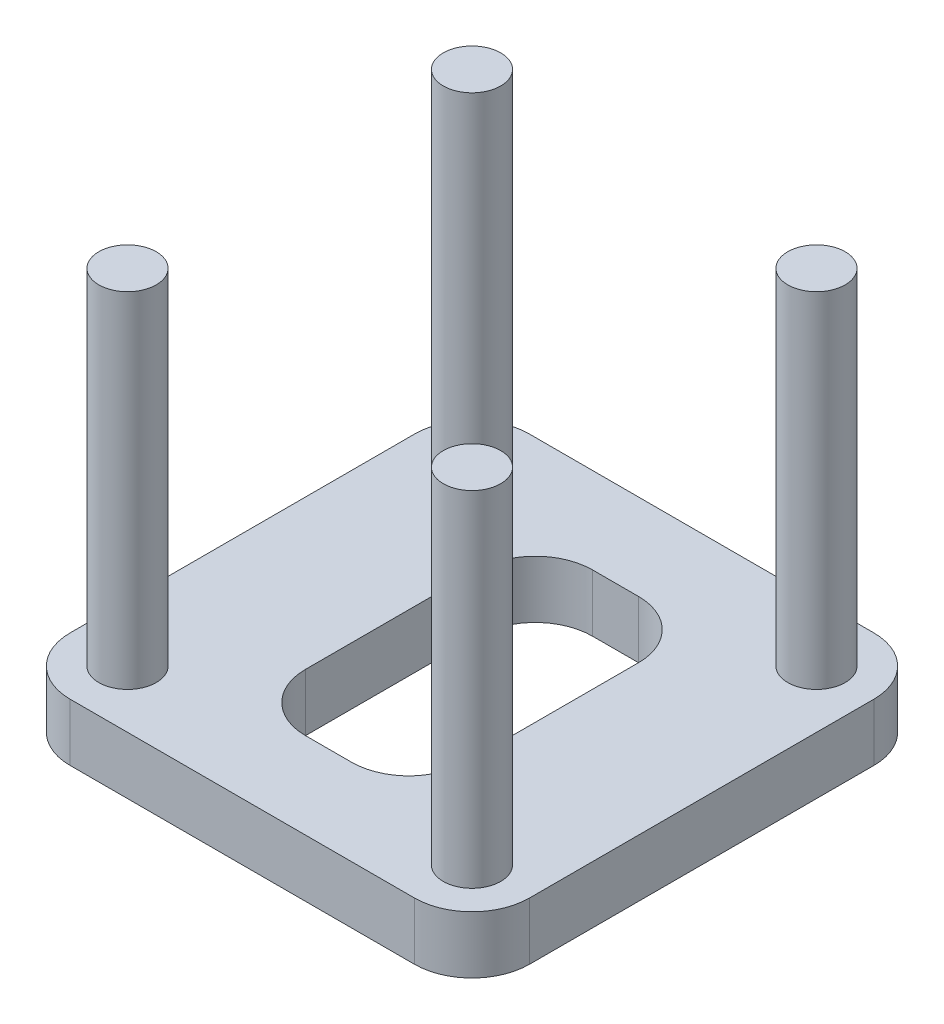
ISO-10303-21;
HEADER;
FILE_DESCRIPTION(('STEP AP214'),'2;1');
FILE_NAME('part.step','',(''),(''),'','','');
FILE_SCHEMA(('AUTOMOTIVE_DESIGN { 1 0 10303 214 1 1 1 1 }'));
ENDSEC;
DATA;
#1=APPLICATION_CONTEXT('core data for automotive mechanical design processes');
#2=APPLICATION_PROTOCOL_DEFINITION('international standard','automotive_design',2000,#1);
#3=PRODUCT_CONTEXT('',#1,'mechanical');
#4=PRODUCT('Part','Part','',(#3));
#5=PRODUCT_RELATED_PRODUCT_CATEGORY('part','',(#4));
#6=PRODUCT_DEFINITION_FORMATION('','',#4);
#7=PRODUCT_DEFINITION_CONTEXT('part definition',#1,'design');
#8=PRODUCT_DEFINITION('design','',#6,#7);
#9=PRODUCT_DEFINITION_SHAPE('','',#8);
#10=(LENGTH_UNIT() NAMED_UNIT(*) SI_UNIT(.MILLI.,.METRE.));
#11=(NAMED_UNIT(*) PLANE_ANGLE_UNIT() SI_UNIT($,.RADIAN.));
#12=(NAMED_UNIT(*) SI_UNIT($,.STERADIAN.) SOLID_ANGLE_UNIT());
#13=UNCERTAINTY_MEASURE_WITH_UNIT(LENGTH_MEASURE(1.E-05),#10,'distance_accuracy_value','');
#14=(GEOMETRIC_REPRESENTATION_CONTEXT(3) GLOBAL_UNCERTAINTY_ASSIGNED_CONTEXT((#13)) GLOBAL_UNIT_ASSIGNED_CONTEXT((#10,
#11,#12)) REPRESENTATION_CONTEXT('',''));
#15=CARTESIAN_POINT('',(0.,0.,0.));
#16=DIRECTION('',(0.,0.,1.));
#17=DIRECTION('',(1.,0.,0.));
#18=AXIS2_PLACEMENT_3D('',#15,#16,#17);
#19=CARTESIAN_POINT('',(0.,0.,0.));
#20=DIRECTION('',(0.,-1.,0.));
#21=DIRECTION('',(0.,0.,-1.));
#22=AXIS2_PLACEMENT_3D('',#19,#20,#21);
#23=PLANE('',#22);
#24=CARTESIAN_POINT('',(4.00000000000001,0.,15.));
#25=DIRECTION('',(0.,1.,0.));
#26=DIRECTION('',(0.,0.,1.));
#27=AXIS2_PLACEMENT_3D('',#24,#25,#26);
#28=CIRCLE('',#27,10.);
#29=CARTESIAN_POINT('',(4.00000000000001,0.,25.));
#30=VERTEX_POINT('',#29);
#31=CARTESIAN_POINT('',(14.,0.,15.));
#32=VERTEX_POINT('',#31);
#33=EDGE_CURVE('E202',#30,#32,#28,.T.);
#34=ORIENTED_EDGE('',*,*,#33,.T.);
#35=DIRECTION('',(0.,0.,-1.));
#36=VECTOR('',#35,1.);
#37=CARTESIAN_POINT('',(14.,0.,15.));
#38=LINE('',#37,#36);
#39=CARTESIAN_POINT('',(14.,0.,-15.));
#40=VERTEX_POINT('',#39);
#41=EDGE_CURVE('E211',#32,#40,#38,.T.);
#42=ORIENTED_EDGE('',*,*,#41,.T.);
#43=CARTESIAN_POINT('',(4.00000000000001,0.,-15.));
#44=DIRECTION('',(0.,1.,0.));
#45=DIRECTION('',(0.,0.,-1.));
#46=AXIS2_PLACEMENT_3D('',#43,#44,#45);
#47=CIRCLE('',#46,10.);
#48=CARTESIAN_POINT('',(4.00000000000001,0.,-25.));
#49=VERTEX_POINT('',#48);
#50=EDGE_CURVE('E54',#40,#49,#47,.T.);
#51=ORIENTED_EDGE('',*,*,#50,.T.);
#52=DIRECTION('',(-1.,0.,0.));
#53=VECTOR('',#52,1.);
#54=CARTESIAN_POINT('',(-4.00000000000001,0.,-25.));
#55=LINE('',#54,#53);
#56=CARTESIAN_POINT('',(-4.00000000000001,0.,-25.));
#57=VERTEX_POINT('',#56);
#58=EDGE_CURVE('E228',#49,#57,#55,.T.);
#59=ORIENTED_EDGE('',*,*,#58,.T.);
#60=CARTESIAN_POINT('',(-4.00000000000001,0.,-15.));
#61=DIRECTION('',(0.,1.,0.));
#62=DIRECTION('',(0.,0.,-1.));
#63=AXIS2_PLACEMENT_3D('',#60,#61,#62);
#64=CIRCLE('',#63,10.);
#65=CARTESIAN_POINT('',(-14.,0.,-15.));
#66=VERTEX_POINT('',#65);
#67=EDGE_CURVE('E231',#57,#66,#64,.T.);
#68=ORIENTED_EDGE('',*,*,#67,.T.);
#69=DIRECTION('',(0.,0.,1.));
#70=VECTOR('',#69,1.);
#71=CARTESIAN_POINT('',(-14.,0.,15.));
#72=LINE('',#71,#70);
#73=CARTESIAN_POINT('',(-14.,0.,15.));
#74=VERTEX_POINT('',#73);
#75=EDGE_CURVE('E234',#66,#74,#72,.T.);
#76=ORIENTED_EDGE('',*,*,#75,.T.);
#77=CARTESIAN_POINT('',(-4.00000000000001,0.,15.));
#78=DIRECTION('',(0.,1.,0.));
#79=DIRECTION('',(0.,0.,-1.));
#80=AXIS2_PLACEMENT_3D('',#77,#78,#79);
#81=CIRCLE('',#80,10.);
#82=CARTESIAN_POINT('',(-4.00000000000001,0.,25.));
#83=VERTEX_POINT('',#82);
#84=EDGE_CURVE('E237',#74,#83,#81,.T.);
#85=ORIENTED_EDGE('',*,*,#84,.T.);
#86=DIRECTION('',(1.,0.,0.));
#87=VECTOR('',#86,1.);
#88=CARTESIAN_POINT('',(-4.00000000000001,0.,25.));
#89=LINE('',#88,#87);
#90=EDGE_CURVE('E208',#83,#30,#89,.T.);
#91=ORIENTED_EDGE('',*,*,#90,.T.);
#92=EDGE_LOOP('',(#34,#42,#51,#59,#68,#76,#85,#91));
#93=FACE_BOUND('',#92,.T.);
#94=DIRECTION('',(0.,0.,1.));
#95=VECTOR('',#94,1.);
#96=CARTESIAN_POINT('',(-40.,0.,40.));
#97=LINE('',#96,#95);
#98=CARTESIAN_POINT('',(-40.,0.,-30.));
#99=VERTEX_POINT('',#98);
#100=CARTESIAN_POINT('',(-40.,0.,30.));
#101=VERTEX_POINT('',#100);
#102=EDGE_CURVE('E356',#99,#101,#97,.T.);
#103=ORIENTED_EDGE('',*,*,#102,.F.);
#104=CARTESIAN_POINT('',(-30.,0.,-30.));
#105=DIRECTION('',(0.,-1.,0.));
#106=DIRECTION('',(0.,0.,-1.));
#107=AXIS2_PLACEMENT_3D('',#104,#105,#106);
#108=CIRCLE('',#107,10.);
#109=CARTESIAN_POINT('',(-30.,0.,-40.));
#110=VERTEX_POINT('',#109);
#111=EDGE_CURVE('E371',#99,#110,#108,.T.);
#112=ORIENTED_EDGE('',*,*,#111,.T.);
#113=DIRECTION('',(-1.,0.,0.));
#114=VECTOR('',#113,1.);
#115=CARTESIAN_POINT('',(-40.,0.,-40.));
#116=LINE('',#115,#114);
#117=CARTESIAN_POINT('',(30.,0.,-40.));
#118=VERTEX_POINT('',#117);
#119=EDGE_CURVE('E353',#118,#110,#116,.T.);
#120=ORIENTED_EDGE('',*,*,#119,.F.);
#121=CARTESIAN_POINT('',(30.,0.,-30.));
#122=DIRECTION('',(0.,-1.,0.));
#123=DIRECTION('',(0.,0.,-1.));
#124=AXIS2_PLACEMENT_3D('',#121,#122,#123);
#125=CIRCLE('',#124,10.);
#126=CARTESIAN_POINT('',(40.,0.,-30.));
#127=VERTEX_POINT('',#126);
#128=EDGE_CURVE('E369',#118,#127,#125,.T.);
#129=ORIENTED_EDGE('',*,*,#128,.T.);
#130=DIRECTION('',(0.,0.,-1.));
#131=VECTOR('',#130,1.);
#132=CARTESIAN_POINT('',(40.,0.,40.));
#133=LINE('',#132,#131);
#134=CARTESIAN_POINT('',(40.,0.,30.));
#135=VERTEX_POINT('',#134);
#136=EDGE_CURVE('E281',#135,#127,#133,.T.);
#137=ORIENTED_EDGE('',*,*,#136,.F.);
#138=CARTESIAN_POINT('',(30.,0.,30.));
#139=DIRECTION('',(0.,-1.,0.));
#140=DIRECTION('',(0.,0.,-1.));
#141=AXIS2_PLACEMENT_3D('',#138,#139,#140);
#142=CIRCLE('',#141,10.);
#143=CARTESIAN_POINT('',(30.,0.,40.));
#144=VERTEX_POINT('',#143);
#145=EDGE_CURVE('E367',#135,#144,#142,.T.);
#146=ORIENTED_EDGE('',*,*,#145,.T.);
#147=DIRECTION('',(1.,0.,0.));
#148=VECTOR('',#147,1.);
#149=CARTESIAN_POINT('',(-40.,0.,40.));
#150=LINE('',#149,#148);
#151=CARTESIAN_POINT('',(-30.,0.,40.));
#152=VERTEX_POINT('',#151);
#153=EDGE_CURVE('E341',#152,#144,#150,.T.);
#154=ORIENTED_EDGE('',*,*,#153,.F.);
#155=CARTESIAN_POINT('',(-30.,0.,30.));
#156=DIRECTION('',(0.,-1.,0.));
#157=DIRECTION('',(0.,0.,-1.));
#158=AXIS2_PLACEMENT_3D('',#155,#156,#157);
#159=CIRCLE('',#158,10.);
#160=EDGE_CURVE('E365',#152,#101,#159,.T.);
#161=ORIENTED_EDGE('',*,*,#160,.T.);
#162=EDGE_LOOP('',(#103,#112,#120,#129,#137,#146,#154,#161));
#163=FACE_BOUND('',#162,.T.);
#164=DIRECTION('',(0.,0.,-1.));
#165=VECTOR('',#164,1.);
#166=CARTESIAN_POINT('',(32.,0.,-5.));
#167=LINE('',#166,#165);
#168=CARTESIAN_POINT('',(32.,0.,5.));
#169=VERTEX_POINT('',#168);
#170=CARTESIAN_POINT('',(32.,0.,-5.));
#171=VERTEX_POINT('',#170);
#172=EDGE_CURVE('E320',#169,#171,#167,.T.);
#173=ORIENTED_EDGE('',*,*,#172,.T.);
#174=DIRECTION('',(-1.,0.,0.));
#175=VECTOR('',#174,1.);
#176=CARTESIAN_POINT('',(22.,0.,-5.));
#177=LINE('',#176,#175);
#178=CARTESIAN_POINT('',(22.,0.,-5.));
#179=VERTEX_POINT('',#178);
#180=EDGE_CURVE('E323',#171,#179,#177,.T.);
#181=ORIENTED_EDGE('',*,*,#180,.T.);
#182=DIRECTION('',(0.,0.,1.));
#183=VECTOR('',#182,1.);
#184=CARTESIAN_POINT('',(22.,0.,-5.));
#185=LINE('',#184,#183);
#186=CARTESIAN_POINT('',(22.,0.,5.));
#187=VERTEX_POINT('',#186);
#188=EDGE_CURVE('E259',#179,#187,#185,.T.);
#189=ORIENTED_EDGE('',*,*,#188,.T.);
#190=DIRECTION('',(1.,0.,0.));
#191=VECTOR('',#190,1.);
#192=CARTESIAN_POINT('',(22.,0.,5.));
#193=LINE('',#192,#191);
#194=EDGE_CURVE('E317',#187,#169,#193,.T.);
#195=ORIENTED_EDGE('',*,*,#194,.T.);
#196=EDGE_LOOP('',(#173,#181,#189,#195));
#197=FACE_BOUND('',#196,.T.);
#198=DIRECTION('',(0.,0.,-1.));
#199=VECTOR('',#198,1.);
#200=CARTESIAN_POINT('',(-22.,0.,-5.));
#201=LINE('',#200,#199);
#202=CARTESIAN_POINT('',(-22.,0.,5.));
#203=VERTEX_POINT('',#202);
#204=CARTESIAN_POINT('',(-22.,0.,-5.));
#205=VERTEX_POINT('',#204);
#206=EDGE_CURVE('E289',#203,#205,#201,.T.);
#207=ORIENTED_EDGE('',*,*,#206,.T.);
#208=DIRECTION('',(-1.,0.,0.));
#209=VECTOR('',#208,1.);
#210=CARTESIAN_POINT('',(-32.,0.,-5.));
#211=LINE('',#210,#209);
#212=CARTESIAN_POINT('',(-32.,0.,-5.));
#213=VERTEX_POINT('',#212);
#214=EDGE_CURVE('E292',#205,#213,#211,.T.);
#215=ORIENTED_EDGE('',*,*,#214,.T.);
#216=DIRECTION('',(0.,0.,1.));
#217=VECTOR('',#216,1.);
#218=CARTESIAN_POINT('',(-32.,0.,-5.));
#219=LINE('',#218,#217);
#220=CARTESIAN_POINT('',(-32.,0.,5.));
#221=VERTEX_POINT('',#220);
#222=EDGE_CURVE('E282',#213,#221,#219,.T.);
#223=ORIENTED_EDGE('',*,*,#222,.T.);
#224=DIRECTION('',(1.,0.,0.));
#225=VECTOR('',#224,1.);
#226=CARTESIAN_POINT('',(-32.,0.,5.));
#227=LINE('',#226,#225);
#228=EDGE_CURVE('E285',#221,#203,#227,.T.);
#229=ORIENTED_EDGE('',*,*,#228,.T.);
#230=EDGE_LOOP('',(#207,#215,#223,#229));
#231=FACE_BOUND('',#230,.T.);
#232=ADVANCED_FACE('F39',(#93,#163,#197,#231),#23,.T.);
#233=CARTESIAN_POINT('',(40.,10.,40.));
#234=DIRECTION('',(-1.,0.,0.));
#235=DIRECTION('',(0.,0.,1.));
#236=AXIS2_PLACEMENT_3D('',#233,#234,#235);
#237=PLANE('',#236);
#238=ORIENTED_EDGE('',*,*,#136,.T.);
#239=DIRECTION('',(0.,-1.,0.));
#240=VECTOR('',#239,1.);
#241=CARTESIAN_POINT('',(40.,10.,-30.));
#242=LINE('',#241,#240);
#243=CARTESIAN_POINT('',(40.,10.,-30.));
#244=VERTEX_POINT('',#243);
#245=EDGE_CURVE('E389',#127,#244,#242,.F.);
#246=ORIENTED_EDGE('',*,*,#245,.T.);
#247=DIRECTION('',(0.,0.,-1.));
#248=VECTOR('',#247,1.);
#249=CARTESIAN_POINT('',(40.,10.,40.));
#250=LINE('',#249,#248);
#251=CARTESIAN_POINT('',(40.,10.,30.));
#252=VERTEX_POINT('',#251);
#253=EDGE_CURVE('E337',#252,#244,#250,.T.);
#254=ORIENTED_EDGE('',*,*,#253,.F.);
#255=DIRECTION('',(0.,-1.,0.));
#256=VECTOR('',#255,1.);
#257=CARTESIAN_POINT('',(40.,10.,30.));
#258=LINE('',#257,#256);
#259=EDGE_CURVE('E386',#252,#135,#258,.T.);
#260=ORIENTED_EDGE('',*,*,#259,.T.);
#261=EDGE_LOOP('',(#238,#246,#254,#260));
#262=FACE_BOUND('',#261,.T.);
#263=ADVANCED_FACE('F448',(#262),#237,.F.);
#264=CARTESIAN_POINT('',(-40.,10.,-40.));
#265=DIRECTION('',(0.,0.,1.));
#266=DIRECTION('',(1.,0.,0.));
#267=AXIS2_PLACEMENT_3D('',#264,#265,#266);
#268=PLANE('',#267);
#269=ORIENTED_EDGE('',*,*,#119,.T.);
#270=DIRECTION('',(0.,-1.,0.));
#271=VECTOR('',#270,1.);
#272=CARTESIAN_POINT('',(-30.,10.,-40.));
#273=LINE('',#272,#271);
#274=CARTESIAN_POINT('',(-30.,10.,-40.));
#275=VERTEX_POINT('',#274);
#276=EDGE_CURVE('E376',#110,#275,#273,.F.);
#277=ORIENTED_EDGE('',*,*,#276,.T.);
#278=DIRECTION('',(-1.,0.,0.));
#279=VECTOR('',#278,1.);
#280=CARTESIAN_POINT('',(-40.,10.,-40.));
#281=LINE('',#280,#279);
#282=CARTESIAN_POINT('',(30.,10.,-40.));
#283=VERTEX_POINT('',#282);
#284=EDGE_CURVE('E340',#283,#275,#281,.T.);
#285=ORIENTED_EDGE('',*,*,#284,.F.);
#286=DIRECTION('',(0.,-1.,0.));
#287=VECTOR('',#286,1.);
#288=CARTESIAN_POINT('',(30.,10.,-40.));
#289=LINE('',#288,#287);
#290=EDGE_CURVE('E373',#283,#118,#289,.T.);
#291=ORIENTED_EDGE('',*,*,#290,.T.);
#292=EDGE_LOOP('',(#269,#277,#285,#291));
#293=FACE_BOUND('',#292,.T.);
#294=ADVANCED_FACE('F452',(#293),#268,.F.);
#295=CARTESIAN_POINT('',(-40.,10.,40.));
#296=DIRECTION('',(1.,0.,0.));
#297=DIRECTION('',(0.,0.,-1.));
#298=AXIS2_PLACEMENT_3D('',#295,#296,#297);
#299=PLANE('',#298);
#300=DIRECTION('',(0.,0.,1.));
#301=VECTOR('',#300,1.);
#302=CARTESIAN_POINT('',(-40.,10.,40.));
#303=LINE('',#302,#301);
#304=CARTESIAN_POINT('',(-40.,10.,-30.));
#305=VERTEX_POINT('',#304);
#306=CARTESIAN_POINT('',(-40.,10.,30.));
#307=VERTEX_POINT('',#306);
#308=EDGE_CURVE('E344',#305,#307,#303,.T.);
#309=ORIENTED_EDGE('',*,*,#308,.F.);
#310=DIRECTION('',(0.,-1.,0.));
#311=VECTOR('',#310,1.);
#312=CARTESIAN_POINT('',(-40.,10.,-30.));
#313=LINE('',#312,#311);
#314=EDGE_CURVE('E362',#305,#99,#313,.T.);
#315=ORIENTED_EDGE('',*,*,#314,.T.);
#316=ORIENTED_EDGE('',*,*,#102,.T.);
#317=DIRECTION('',(0.,-1.,0.));
#318=VECTOR('',#317,1.);
#319=CARTESIAN_POINT('',(-40.,10.,30.));
#320=LINE('',#319,#318);
#321=EDGE_CURVE('E350',#101,#307,#320,.F.);
#322=ORIENTED_EDGE('',*,*,#321,.T.);
#323=EDGE_LOOP('',(#309,#315,#316,#322));
#324=FACE_BOUND('',#323,.T.);
#325=ADVANCED_FACE('F430',(#324),#299,.F.);
#326=CARTESIAN_POINT('',(-40.,10.,40.));
#327=DIRECTION('',(0.,0.,-1.));
#328=DIRECTION('',(-1.,0.,0.));
#329=AXIS2_PLACEMENT_3D('',#326,#327,#328);
#330=PLANE('',#329);
#331=ORIENTED_EDGE('',*,*,#153,.T.);
#332=DIRECTION('',(0.,-1.,0.));
#333=VECTOR('',#332,1.);
#334=CARTESIAN_POINT('',(30.,10.,40.));
#335=LINE('',#334,#333);
#336=CARTESIAN_POINT('',(30.,10.,40.));
#337=VERTEX_POINT('',#336);
#338=EDGE_CURVE('E394',#144,#337,#335,.F.);
#339=ORIENTED_EDGE('',*,*,#338,.T.);
#340=DIRECTION('',(1.,0.,0.));
#341=VECTOR('',#340,1.);
#342=CARTESIAN_POINT('',(-40.,10.,40.));
#343=LINE('',#342,#341);
#344=CARTESIAN_POINT('',(-30.,10.,40.));
#345=VERTEX_POINT('',#344);
#346=EDGE_CURVE('E347',#345,#337,#343,.T.);
#347=ORIENTED_EDGE('',*,*,#346,.F.);
#348=DIRECTION('',(0.,-1.,0.));
#349=VECTOR('',#348,1.);
#350=CARTESIAN_POINT('',(-30.,10.,40.));
#351=LINE('',#350,#349);
#352=EDGE_CURVE('E391',#345,#152,#351,.T.);
#353=ORIENTED_EDGE('',*,*,#352,.T.);
#354=EDGE_LOOP('',(#331,#339,#347,#353));
#355=FACE_BOUND('',#354,.T.);
#356=ADVANCED_FACE('F410',(#355),#330,.F.);
#357=CARTESIAN_POINT('',(0.,10.,0.));
#358=DIRECTION('',(0.,-1.,0.));
#359=DIRECTION('',(0.,0.,-1.));
#360=AXIS2_PLACEMENT_3D('',#357,#358,#359);
#361=PLANE('',#360);
#362=CARTESIAN_POINT('',(30.,10.,30.));
#363=DIRECTION('',(0.,-1.,0.));
#364=DIRECTION('',(0.,0.,-1.));
#365=AXIS2_PLACEMENT_3D('',#362,#363,#364);
#366=CIRCLE('',#365,5.);
#367=CARTESIAN_POINT('',(30.,10.,25.));
#368=VERTEX_POINT('',#367);
#369=EDGE_CURVE('E12',#368,#368,#366,.F.);
#370=ORIENTED_EDGE('',*,*,#369,.F.);
#371=EDGE_LOOP('',(#370));
#372=FACE_BOUND('',#371,.T.);
#373=CARTESIAN_POINT('',(-30.,10.,30.));
#374=DIRECTION('',(0.,-1.,0.));
#375=DIRECTION('',(0.,0.,-1.));
#376=AXIS2_PLACEMENT_3D('',#373,#374,#375);
#377=CIRCLE('',#376,5.);
#378=CARTESIAN_POINT('',(-30.,10.,25.));
#379=VERTEX_POINT('',#378);
#380=EDGE_CURVE('E47',#379,#379,#377,.F.);
#381=ORIENTED_EDGE('',*,*,#380,.F.);
#382=EDGE_LOOP('',(#381));
#383=FACE_BOUND('',#382,.T.);
#384=CARTESIAN_POINT('',(30.,10.,-30.));
#385=DIRECTION('',(0.,-1.,0.));
#386=DIRECTION('',(0.,0.,-1.));
#387=AXIS2_PLACEMENT_3D('',#384,#385,#386);
#388=CIRCLE('',#387,5.);
#389=CARTESIAN_POINT('',(30.,10.,-35.));
#390=VERTEX_POINT('',#389);
#391=EDGE_CURVE('E399',#390,#390,#388,.F.);
#392=ORIENTED_EDGE('',*,*,#391,.F.);
#393=EDGE_LOOP('',(#392));
#394=FACE_BOUND('',#393,.T.);
#395=CARTESIAN_POINT('',(-30.,10.,-30.));
#396=DIRECTION('',(0.,-1.,0.));
#397=DIRECTION('',(0.,0.,-1.));
#398=AXIS2_PLACEMENT_3D('',#395,#396,#397);
#399=CIRCLE('',#398,5.);
#400=CARTESIAN_POINT('',(-30.,10.,-35.));
#401=VERTEX_POINT('',#400);
#402=EDGE_CURVE('E396',#401,#401,#399,.F.);
#403=ORIENTED_EDGE('',*,*,#402,.F.);
#404=EDGE_LOOP('',(#403));
#405=FACE_BOUND('',#404,.T.);
#406=DIRECTION('',(0.,0.,-1.));
#407=VECTOR('',#406,1.);
#408=CARTESIAN_POINT('',(14.,10.,15.));
#409=LINE('',#408,#407);
#410=CARTESIAN_POINT('',(14.,10.,15.));
#411=VERTEX_POINT('',#410);
#412=CARTESIAN_POINT('',(14.,10.,-15.));
#413=VERTEX_POINT('',#412);
#414=EDGE_CURVE('E241',#411,#413,#409,.T.);
#415=ORIENTED_EDGE('',*,*,#414,.F.);
#416=CARTESIAN_POINT('',(4.00000000000001,10.,15.));
#417=DIRECTION('',(0.,1.,0.));
#418=DIRECTION('',(0.,0.,1.));
#419=AXIS2_PLACEMENT_3D('',#416,#417,#418);
#420=CIRCLE('',#419,10.);
#421=CARTESIAN_POINT('',(4.00000000000001,10.,25.));
#422=VERTEX_POINT('',#421);
#423=EDGE_CURVE('E62',#422,#411,#420,.T.);
#424=ORIENTED_EDGE('',*,*,#423,.F.);
#425=DIRECTION('',(1.,0.,0.));
#426=VECTOR('',#425,1.);
#427=CARTESIAN_POINT('',(-4.00000000000001,10.,25.));
#428=LINE('',#427,#426);
#429=CARTESIAN_POINT('',(-4.00000000000001,10.,25.));
#430=VERTEX_POINT('',#429);
#431=EDGE_CURVE('E218',#430,#422,#428,.T.);
#432=ORIENTED_EDGE('',*,*,#431,.F.);
#433=CARTESIAN_POINT('',(-4.00000000000001,10.,15.));
#434=DIRECTION('',(0.,1.,0.));
#435=DIRECTION('',(0.,0.,-1.));
#436=AXIS2_PLACEMENT_3D('',#433,#434,#435);
#437=CIRCLE('',#436,10.);
#438=CARTESIAN_POINT('',(-14.,10.,15.));
#439=VERTEX_POINT('',#438);
#440=EDGE_CURVE('E221',#439,#430,#437,.T.);
#441=ORIENTED_EDGE('',*,*,#440,.F.);
#442=DIRECTION('',(0.,0.,1.));
#443=VECTOR('',#442,1.);
#444=CARTESIAN_POINT('',(-14.,10.,15.));
#445=LINE('',#444,#443);
#446=CARTESIAN_POINT('',(-14.,10.,-15.));
#447=VERTEX_POINT('',#446);
#448=EDGE_CURVE('E252',#447,#439,#445,.T.);
#449=ORIENTED_EDGE('',*,*,#448,.F.);
#450=CARTESIAN_POINT('',(-4.00000000000001,10.,-15.));
#451=DIRECTION('',(0.,1.,0.));
#452=DIRECTION('',(0.,0.,-1.));
#453=AXIS2_PLACEMENT_3D('',#450,#451,#452);
#454=CIRCLE('',#453,10.);
#455=CARTESIAN_POINT('',(-4.00000000000001,10.,-25.));
#456=VERTEX_POINT('',#455);
#457=EDGE_CURVE('E249',#456,#447,#454,.T.);
#458=ORIENTED_EDGE('',*,*,#457,.F.);
#459=DIRECTION('',(-1.,0.,0.));
#460=VECTOR('',#459,1.);
#461=CARTESIAN_POINT('',(-4.00000000000001,10.,-25.));
#462=LINE('',#461,#460);
#463=CARTESIAN_POINT('',(4.00000000000001,10.,-25.));
#464=VERTEX_POINT('',#463);
#465=EDGE_CURVE('E246',#464,#456,#462,.T.);
#466=ORIENTED_EDGE('',*,*,#465,.F.);
#467=CARTESIAN_POINT('',(4.00000000000001,10.,-15.));
#468=DIRECTION('',(0.,1.,0.));
#469=DIRECTION('',(0.,0.,-1.));
#470=AXIS2_PLACEMENT_3D('',#467,#468,#469);
#471=CIRCLE('',#470,10.);
#472=EDGE_CURVE('E243',#413,#464,#471,.T.);
#473=ORIENTED_EDGE('',*,*,#472,.F.);
#474=EDGE_LOOP('',(#415,#424,#432,#441,#449,#458,#466,#473));
#475=FACE_BOUND('',#474,.T.);
#476=ORIENTED_EDGE('',*,*,#284,.T.);
#477=CARTESIAN_POINT('',(-30.,10.,-30.));
#478=DIRECTION('',(0.,-1.,0.));
#479=DIRECTION('',(0.,0.,-1.));
#480=AXIS2_PLACEMENT_3D('',#477,#478,#479);
#481=CIRCLE('',#480,10.);
#482=EDGE_CURVE('E384',#275,#305,#481,.F.);
#483=ORIENTED_EDGE('',*,*,#482,.T.);
#484=ORIENTED_EDGE('',*,*,#308,.T.);
#485=CARTESIAN_POINT('',(-30.,10.,30.));
#486=DIRECTION('',(0.,-1.,0.));
#487=DIRECTION('',(0.,0.,-1.));
#488=AXIS2_PLACEMENT_3D('',#485,#486,#487);
#489=CIRCLE('',#488,10.);
#490=EDGE_CURVE('E378',#307,#345,#489,.F.);
#491=ORIENTED_EDGE('',*,*,#490,.T.);
#492=ORIENTED_EDGE('',*,*,#346,.T.);
#493=CARTESIAN_POINT('',(30.,10.,30.));
#494=DIRECTION('',(0.,-1.,0.));
#495=DIRECTION('',(0.,0.,-1.));
#496=AXIS2_PLACEMENT_3D('',#493,#494,#495);
#497=CIRCLE('',#496,10.);
#498=EDGE_CURVE('E380',#337,#252,#497,.F.);
#499=ORIENTED_EDGE('',*,*,#498,.T.);
#500=ORIENTED_EDGE('',*,*,#253,.T.);
#501=CARTESIAN_POINT('',(30.,10.,-30.));
#502=DIRECTION('',(0.,-1.,0.));
#503=DIRECTION('',(0.,0.,-1.));
#504=AXIS2_PLACEMENT_3D('',#501,#502,#503);
#505=CIRCLE('',#504,10.);
#506=EDGE_CURVE('E382',#244,#283,#505,.F.);
#507=ORIENTED_EDGE('',*,*,#506,.T.);
#508=EDGE_LOOP('',(#476,#483,#484,#491,#492,#499,#500,#507));
#509=FACE_BOUND('',#508,.T.);
#510=ADVANCED_FACE('F406',(#372,#383,#394,#405,#475,#509),#361,.F.);
#511=CARTESIAN_POINT('',(-30.,10.,-30.));
#512=DIRECTION('',(0.,-1.,0.));
#513=DIRECTION('',(0.,0.,-1.));
#514=AXIS2_PLACEMENT_3D('',#511,#512,#513);
#515=CYLINDRICAL_SURFACE('',#514,10.);
#516=ORIENTED_EDGE('',*,*,#482,.F.);
#517=ORIENTED_EDGE('',*,*,#276,.F.);
#518=ORIENTED_EDGE('',*,*,#111,.F.);
#519=ORIENTED_EDGE('',*,*,#314,.F.);
#520=EDGE_LOOP('',(#516,#517,#518,#519));
#521=FACE_BOUND('',#520,.T.);
#522=ADVANCED_FACE('F409',(#521),#515,.T.);
#523=CARTESIAN_POINT('',(30.,10.,-30.));
#524=DIRECTION('',(0.,-1.,0.));
#525=DIRECTION('',(0.,0.,-1.));
#526=AXIS2_PLACEMENT_3D('',#523,#524,#525);
#527=CYLINDRICAL_SURFACE('',#526,10.);
#528=ORIENTED_EDGE('',*,*,#506,.F.);
#529=ORIENTED_EDGE('',*,*,#245,.F.);
#530=ORIENTED_EDGE('',*,*,#128,.F.);
#531=ORIENTED_EDGE('',*,*,#290,.F.);
#532=EDGE_LOOP('',(#528,#529,#530,#531));
#533=FACE_BOUND('',#532,.T.);
#534=ADVANCED_FACE('F451',(#533),#527,.T.);
#535=CARTESIAN_POINT('',(30.,10.,30.));
#536=DIRECTION('',(0.,-1.,0.));
#537=DIRECTION('',(0.,0.,-1.));
#538=AXIS2_PLACEMENT_3D('',#535,#536,#537);
#539=CYLINDRICAL_SURFACE('',#538,10.);
#540=ORIENTED_EDGE('',*,*,#498,.F.);
#541=ORIENTED_EDGE('',*,*,#338,.F.);
#542=ORIENTED_EDGE('',*,*,#145,.F.);
#543=ORIENTED_EDGE('',*,*,#259,.F.);
#544=EDGE_LOOP('',(#540,#541,#542,#543));
#545=FACE_BOUND('',#544,.T.);
#546=ADVANCED_FACE('F445',(#545),#539,.T.);
#547=CARTESIAN_POINT('',(-30.,10.,30.));
#548=DIRECTION('',(0.,-1.,0.));
#549=DIRECTION('',(0.,0.,-1.));
#550=AXIS2_PLACEMENT_3D('',#547,#548,#549);
#551=CYLINDRICAL_SURFACE('',#550,10.);
#552=ORIENTED_EDGE('',*,*,#490,.F.);
#553=ORIENTED_EDGE('',*,*,#321,.F.);
#554=ORIENTED_EDGE('',*,*,#160,.F.);
#555=ORIENTED_EDGE('',*,*,#352,.F.);
#556=EDGE_LOOP('',(#552,#553,#554,#555));
#557=FACE_BOUND('',#556,.T.);
#558=ADVANCED_FACE('F41',(#557),#551,.T.);
#559=CARTESIAN_POINT('',(22.,24.142135623731,-5.));
#560=DIRECTION('',(0.,0.,1.));
#561=DIRECTION('',(1.,0.,0.));
#562=AXIS2_PLACEMENT_3D('',#559,#560,#561);
#563=PLANE('',#562);
#564=DIRECTION('',(0.,-1.,0.));
#565=VECTOR('',#564,1.);
#566=CARTESIAN_POINT('',(22.,24.142135623731,-5.));
#567=LINE('',#566,#565);
#568=CARTESIAN_POINT('',(22.,8.,-5.));
#569=VERTEX_POINT('',#568);
#570=EDGE_CURVE('E326',#569,#179,#567,.T.);
#571=ORIENTED_EDGE('',*,*,#570,.T.);
#572=ORIENTED_EDGE('',*,*,#180,.F.);
#573=DIRECTION('',(0.,-1.,0.));
#574=VECTOR('',#573,1.);
#575=CARTESIAN_POINT('',(32.,24.142135623731,-5.));
#576=LINE('',#575,#574);
#577=CARTESIAN_POINT('',(32.,8.,-5.));
#578=VERTEX_POINT('',#577);
#579=EDGE_CURVE('E328',#578,#171,#576,.T.);
#580=ORIENTED_EDGE('',*,*,#579,.F.);
#581=DIRECTION('',(1.,0.,0.));
#582=VECTOR('',#581,1.);
#583=CARTESIAN_POINT('',(22.,8.,-5.));
#584=LINE('',#583,#582);
#585=EDGE_CURVE('E310',#569,#578,#584,.T.);
#586=ORIENTED_EDGE('',*,*,#585,.F.);
#587=EDGE_LOOP('',(#571,#572,#580,#586));
#588=FACE_BOUND('',#587,.T.);
#589=ADVANCED_FACE('F501',(#588),#563,.T.);
#590=CARTESIAN_POINT('',(32.,24.142135623731,-5.));
#591=DIRECTION('',(-1.,0.,0.));
#592=DIRECTION('',(0.,0.,1.));
#593=AXIS2_PLACEMENT_3D('',#590,#591,#592);
#594=PLANE('',#593);
#595=ORIENTED_EDGE('',*,*,#579,.T.);
#596=ORIENTED_EDGE('',*,*,#172,.F.);
#597=DIRECTION('',(0.,-1.,0.));
#598=VECTOR('',#597,1.);
#599=CARTESIAN_POINT('',(32.,24.142135623731,5.));
#600=LINE('',#599,#598);
#601=CARTESIAN_POINT('',(32.,8.,5.));
#602=VERTEX_POINT('',#601);
#603=EDGE_CURVE('E330',#602,#169,#600,.T.);
#604=ORIENTED_EDGE('',*,*,#603,.F.);
#605=DIRECTION('',(0.,0.,1.));
#606=VECTOR('',#605,1.);
#607=CARTESIAN_POINT('',(32.,8.,-5.));
#608=LINE('',#607,#606);
#609=EDGE_CURVE('E306',#578,#602,#608,.T.);
#610=ORIENTED_EDGE('',*,*,#609,.F.);
#611=EDGE_LOOP('',(#595,#596,#604,#610));
#612=FACE_BOUND('',#611,.T.);
#613=ADVANCED_FACE('F507',(#612),#594,.T.);
#614=CARTESIAN_POINT('',(22.,24.142135623731,5.));
#615=DIRECTION('',(0.,0.,-1.));
#616=DIRECTION('',(-1.,0.,0.));
#617=AXIS2_PLACEMENT_3D('',#614,#615,#616);
#618=PLANE('',#617);
#619=ORIENTED_EDGE('',*,*,#603,.T.);
#620=ORIENTED_EDGE('',*,*,#194,.F.);
#621=DIRECTION('',(0.,-1.,0.));
#622=VECTOR('',#621,1.);
#623=CARTESIAN_POINT('',(22.,24.142135623731,5.));
#624=LINE('',#623,#622);
#625=CARTESIAN_POINT('',(22.,8.,5.));
#626=VERTEX_POINT('',#625);
#627=EDGE_CURVE('E332',#626,#187,#624,.T.);
#628=ORIENTED_EDGE('',*,*,#627,.F.);
#629=DIRECTION('',(-1.,0.,0.));
#630=VECTOR('',#629,1.);
#631=CARTESIAN_POINT('',(22.,8.,5.));
#632=LINE('',#631,#630);
#633=EDGE_CURVE('E309',#602,#626,#632,.T.);
#634=ORIENTED_EDGE('',*,*,#633,.F.);
#635=EDGE_LOOP('',(#619,#620,#628,#634));
#636=FACE_BOUND('',#635,.T.);
#637=ADVANCED_FACE('F515',(#636),#618,.T.);
#638=CARTESIAN_POINT('',(22.,24.142135623731,-5.));
#639=DIRECTION('',(1.,0.,0.));
#640=DIRECTION('',(0.,0.,-1.));
#641=AXIS2_PLACEMENT_3D('',#638,#639,#640);
#642=PLANE('',#641);
#643=ORIENTED_EDGE('',*,*,#627,.T.);
#644=ORIENTED_EDGE('',*,*,#188,.F.);
#645=ORIENTED_EDGE('',*,*,#570,.F.);
#646=DIRECTION('',(0.,0.,-1.));
#647=VECTOR('',#646,1.);
#648=CARTESIAN_POINT('',(22.,8.,-5.));
#649=LINE('',#648,#647);
#650=EDGE_CURVE('E286',#626,#569,#649,.T.);
#651=ORIENTED_EDGE('',*,*,#650,.F.);
#652=EDGE_LOOP('',(#643,#644,#645,#651));
#653=FACE_BOUND('',#652,.T.);
#654=ADVANCED_FACE('F523',(#653),#642,.T.);
#655=CARTESIAN_POINT('',(0.,8.,0.));
#656=DIRECTION('',(0.,-1.,0.));
#657=DIRECTION('',(0.,0.,-1.));
#658=AXIS2_PLACEMENT_3D('',#655,#656,#657);
#659=PLANE('',#658);
#660=ORIENTED_EDGE('',*,*,#633,.T.);
#661=ORIENTED_EDGE('',*,*,#650,.T.);
#662=ORIENTED_EDGE('',*,*,#585,.T.);
#663=ORIENTED_EDGE('',*,*,#609,.T.);
#664=EDGE_LOOP('',(#660,#661,#662,#663));
#665=FACE_BOUND('',#664,.T.);
#666=ADVANCED_FACE('F531',(#665),#659,.T.);
#667=CARTESIAN_POINT('',(-32.,24.142135623731,-5.));
#668=DIRECTION('',(0.,0.,1.));
#669=DIRECTION('',(1.,0.,0.));
#670=AXIS2_PLACEMENT_3D('',#667,#668,#669);
#671=PLANE('',#670);
#672=DIRECTION('',(0.,-1.,0.));
#673=VECTOR('',#672,1.);
#674=CARTESIAN_POINT('',(-32.,24.142135623731,-5.));
#675=LINE('',#674,#673);
#676=CARTESIAN_POINT('',(-32.,8.,-5.));
#677=VERTEX_POINT('',#676);
#678=EDGE_CURVE('E295',#677,#213,#675,.T.);
#679=ORIENTED_EDGE('',*,*,#678,.T.);
#680=ORIENTED_EDGE('',*,*,#214,.F.);
#681=DIRECTION('',(0.,-1.,0.));
#682=VECTOR('',#681,1.);
#683=CARTESIAN_POINT('',(-22.,24.142135623731,-5.));
#684=LINE('',#683,#682);
#685=CARTESIAN_POINT('',(-22.,8.,-5.));
#686=VERTEX_POINT('',#685);
#687=EDGE_CURVE('E297',#686,#205,#684,.T.);
#688=ORIENTED_EDGE('',*,*,#687,.F.);
#689=DIRECTION('',(1.,0.,0.));
#690=VECTOR('',#689,1.);
#691=CARTESIAN_POINT('',(-32.,8.,-5.));
#692=LINE('',#691,#690);
#693=EDGE_CURVE('E275',#677,#686,#692,.T.);
#694=ORIENTED_EDGE('',*,*,#693,.F.);
#695=EDGE_LOOP('',(#679,#680,#688,#694));
#696=FACE_BOUND('',#695,.T.);
#697=ADVANCED_FACE('F538',(#696),#671,.T.);
#698=CARTESIAN_POINT('',(-22.,24.142135623731,-5.));
#699=DIRECTION('',(-1.,0.,0.));
#700=DIRECTION('',(0.,0.,1.));
#701=AXIS2_PLACEMENT_3D('',#698,#699,#700);
#702=PLANE('',#701);
#703=ORIENTED_EDGE('',*,*,#687,.T.);
#704=ORIENTED_EDGE('',*,*,#206,.F.);
#705=DIRECTION('',(0.,-1.,0.));
#706=VECTOR('',#705,1.);
#707=CARTESIAN_POINT('',(-22.,24.142135623731,5.));
#708=LINE('',#707,#706);
#709=CARTESIAN_POINT('',(-22.,8.,5.));
#710=VERTEX_POINT('',#709);
#711=EDGE_CURVE('E299',#710,#203,#708,.T.);
#712=ORIENTED_EDGE('',*,*,#711,.F.);
#713=DIRECTION('',(0.,0.,1.));
#714=VECTOR('',#713,1.);
#715=CARTESIAN_POINT('',(-22.,8.,-5.));
#716=LINE('',#715,#714);
#717=EDGE_CURVE('E271',#686,#710,#716,.T.);
#718=ORIENTED_EDGE('',*,*,#717,.F.);
#719=EDGE_LOOP('',(#703,#704,#712,#718));
#720=FACE_BOUND('',#719,.T.);
#721=ADVANCED_FACE('F546',(#720),#702,.T.);
#722=CARTESIAN_POINT('',(-32.,24.142135623731,5.));
#723=DIRECTION('',(0.,0.,-1.));
#724=DIRECTION('',(-1.,0.,0.));
#725=AXIS2_PLACEMENT_3D('',#722,#723,#724);
#726=PLANE('',#725);
#727=ORIENTED_EDGE('',*,*,#711,.T.);
#728=ORIENTED_EDGE('',*,*,#228,.F.);
#729=DIRECTION('',(0.,-1.,0.));
#730=VECTOR('',#729,1.);
#731=CARTESIAN_POINT('',(-32.,24.142135623731,5.));
#732=LINE('',#731,#730);
#733=CARTESIAN_POINT('',(-32.,8.,5.));
#734=VERTEX_POINT('',#733);
#735=EDGE_CURVE('E301',#734,#221,#732,.T.);
#736=ORIENTED_EDGE('',*,*,#735,.F.);
#737=DIRECTION('',(-1.,0.,0.));
#738=VECTOR('',#737,1.);
#739=CARTESIAN_POINT('',(-32.,8.,5.));
#740=LINE('',#739,#738);
#741=EDGE_CURVE('E274',#710,#734,#740,.T.);
#742=ORIENTED_EDGE('',*,*,#741,.F.);
#743=EDGE_LOOP('',(#727,#728,#736,#742));
#744=FACE_BOUND('',#743,.T.);
#745=ADVANCED_FACE('F554',(#744),#726,.T.);
#746=CARTESIAN_POINT('',(-32.,24.142135623731,-5.));
#747=DIRECTION('',(1.,0.,0.));
#748=DIRECTION('',(0.,0.,-1.));
#749=AXIS2_PLACEMENT_3D('',#746,#747,#748);
#750=PLANE('',#749);
#751=ORIENTED_EDGE('',*,*,#735,.T.);
#752=ORIENTED_EDGE('',*,*,#222,.F.);
#753=ORIENTED_EDGE('',*,*,#678,.F.);
#754=DIRECTION('',(0.,0.,-1.));
#755=VECTOR('',#754,1.);
#756=CARTESIAN_POINT('',(-32.,8.,-5.));
#757=LINE('',#756,#755);
#758=EDGE_CURVE('E278',#734,#677,#757,.T.);
#759=ORIENTED_EDGE('',*,*,#758,.F.);
#760=EDGE_LOOP('',(#751,#752,#753,#759));
#761=FACE_BOUND('',#760,.T.);
#762=ADVANCED_FACE('F562',(#761),#750,.T.);
#763=CARTESIAN_POINT('',(0.,8.,0.));
#764=DIRECTION('',(0.,-1.,0.));
#765=DIRECTION('',(0.,0.,-1.));
#766=AXIS2_PLACEMENT_3D('',#763,#764,#765);
#767=PLANE('',#766);
#768=ORIENTED_EDGE('',*,*,#741,.T.);
#769=ORIENTED_EDGE('',*,*,#758,.T.);
#770=ORIENTED_EDGE('',*,*,#693,.T.);
#771=ORIENTED_EDGE('',*,*,#717,.T.);
#772=EDGE_LOOP('',(#768,#769,#770,#771));
#773=FACE_BOUND('',#772,.T.);
#774=ADVANCED_FACE('F570',(#773),#767,.T.);
#775=CARTESIAN_POINT('',(4.00000000000001,0.,15.));
#776=DIRECTION('',(0.,1.,0.));
#777=DIRECTION('',(0.,0.,1.));
#778=AXIS2_PLACEMENT_3D('',#775,#776,#777);
#779=CYLINDRICAL_SURFACE('',#778,10.);
#780=ORIENTED_EDGE('',*,*,#423,.T.);
#781=DIRECTION('',(0.,1.,0.));
#782=VECTOR('',#781,1.);
#783=CARTESIAN_POINT('',(14.,0.,15.));
#784=LINE('',#783,#782);
#785=EDGE_CURVE('E198',#32,#411,#784,.T.);
#786=ORIENTED_EDGE('',*,*,#785,.F.);
#787=ORIENTED_EDGE('',*,*,#33,.F.);
#788=DIRECTION('',(0.,1.,0.));
#789=VECTOR('',#788,1.);
#790=CARTESIAN_POINT('',(4.00000000000001,0.,25.));
#791=LINE('',#790,#789);
#792=EDGE_CURVE('E257',#30,#422,#791,.T.);
#793=ORIENTED_EDGE('',*,*,#792,.T.);
#794=EDGE_LOOP('',(#780,#786,#787,#793));
#795=FACE_BOUND('',#794,.T.);
#796=ADVANCED_FACE('F200',(#795),#779,.F.);
#797=CARTESIAN_POINT('',(-4.00000000000001,0.,25.));
#798=DIRECTION('',(0.,0.,1.));
#799=DIRECTION('',(1.,0.,0.));
#800=AXIS2_PLACEMENT_3D('',#797,#798,#799);
#801=PLANE('',#800);
#802=ORIENTED_EDGE('',*,*,#431,.T.);
#803=ORIENTED_EDGE('',*,*,#792,.F.);
#804=ORIENTED_EDGE('',*,*,#90,.F.);
#805=DIRECTION('',(0.,1.,0.));
#806=VECTOR('',#805,1.);
#807=CARTESIAN_POINT('',(-4.00000000000001,0.,25.));
#808=LINE('',#807,#806);
#809=EDGE_CURVE('E260',#83,#430,#808,.T.);
#810=ORIENTED_EDGE('',*,*,#809,.T.);
#811=EDGE_LOOP('',(#802,#803,#804,#810));
#812=FACE_BOUND('',#811,.T.);
#813=ADVANCED_FACE('F585',(#812),#801,.F.);
#814=CARTESIAN_POINT('',(-4.00000000000001,0.,15.));
#815=DIRECTION('',(0.,1.,0.));
#816=DIRECTION('',(0.,0.,1.));
#817=AXIS2_PLACEMENT_3D('',#814,#815,#816);
#818=CYLINDRICAL_SURFACE('',#817,10.);
#819=ORIENTED_EDGE('',*,*,#440,.T.);
#820=ORIENTED_EDGE('',*,*,#809,.F.);
#821=ORIENTED_EDGE('',*,*,#84,.F.);
#822=DIRECTION('',(0.,1.,0.));
#823=VECTOR('',#822,1.);
#824=CARTESIAN_POINT('',(-14.,0.,15.));
#825=LINE('',#824,#823);
#826=EDGE_CURVE('E262',#74,#439,#825,.T.);
#827=ORIENTED_EDGE('',*,*,#826,.T.);
#828=EDGE_LOOP('',(#819,#820,#821,#827));
#829=FACE_BOUND('',#828,.T.);
#830=ADVANCED_FACE('F592',(#829),#818,.F.);
#831=CARTESIAN_POINT('',(-14.,0.,15.));
#832=DIRECTION('',(-1.,0.,0.));
#833=DIRECTION('',(0.,0.,1.));
#834=AXIS2_PLACEMENT_3D('',#831,#832,#833);
#835=PLANE('',#834);
#836=ORIENTED_EDGE('',*,*,#448,.T.);
#837=ORIENTED_EDGE('',*,*,#826,.F.);
#838=ORIENTED_EDGE('',*,*,#75,.F.);
#839=DIRECTION('',(0.,1.,0.));
#840=VECTOR('',#839,1.);
#841=CARTESIAN_POINT('',(-14.,0.,-15.));
#842=LINE('',#841,#840);
#843=EDGE_CURVE('E264',#66,#447,#842,.T.);
#844=ORIENTED_EDGE('',*,*,#843,.T.);
#845=EDGE_LOOP('',(#836,#837,#838,#844));
#846=FACE_BOUND('',#845,.T.);
#847=ADVANCED_FACE('F600',(#846),#835,.F.);
#848=CARTESIAN_POINT('',(-4.00000000000001,0.,-15.));
#849=DIRECTION('',(0.,1.,0.));
#850=DIRECTION('',(0.,0.,1.));
#851=AXIS2_PLACEMENT_3D('',#848,#849,#850);
#852=CYLINDRICAL_SURFACE('',#851,10.);
#853=ORIENTED_EDGE('',*,*,#457,.T.);
#854=ORIENTED_EDGE('',*,*,#843,.F.);
#855=ORIENTED_EDGE('',*,*,#67,.F.);
#856=DIRECTION('',(0.,1.,0.));
#857=VECTOR('',#856,1.);
#858=CARTESIAN_POINT('',(-4.00000000000001,0.,-25.));
#859=LINE('',#858,#857);
#860=EDGE_CURVE('E266',#57,#456,#859,.T.);
#861=ORIENTED_EDGE('',*,*,#860,.T.);
#862=EDGE_LOOP('',(#853,#854,#855,#861));
#863=FACE_BOUND('',#862,.T.);
#864=ADVANCED_FACE('F608',(#863),#852,.F.);
#865=CARTESIAN_POINT('',(-4.00000000000001,0.,-25.));
#866=DIRECTION('',(0.,0.,-1.));
#867=DIRECTION('',(-1.,0.,0.));
#868=AXIS2_PLACEMENT_3D('',#865,#866,#867);
#869=PLANE('',#868);
#870=ORIENTED_EDGE('',*,*,#465,.T.);
#871=ORIENTED_EDGE('',*,*,#860,.F.);
#872=ORIENTED_EDGE('',*,*,#58,.F.);
#873=DIRECTION('',(0.,1.,0.));
#874=VECTOR('',#873,1.);
#875=CARTESIAN_POINT('',(4.00000000000001,0.,-25.));
#876=LINE('',#875,#874);
#877=EDGE_CURVE('E268',#49,#464,#876,.T.);
#878=ORIENTED_EDGE('',*,*,#877,.T.);
#879=EDGE_LOOP('',(#870,#871,#872,#878));
#880=FACE_BOUND('',#879,.T.);
#881=ADVANCED_FACE('F616',(#880),#869,.F.);
#882=CARTESIAN_POINT('',(4.00000000000001,0.,-15.));
#883=DIRECTION('',(0.,1.,0.));
#884=DIRECTION('',(0.,0.,1.));
#885=AXIS2_PLACEMENT_3D('',#882,#883,#884);
#886=CYLINDRICAL_SURFACE('',#885,10.);
#887=ORIENTED_EDGE('',*,*,#472,.T.);
#888=ORIENTED_EDGE('',*,*,#877,.F.);
#889=ORIENTED_EDGE('',*,*,#50,.F.);
#890=DIRECTION('',(0.,1.,0.));
#891=VECTOR('',#890,1.);
#892=CARTESIAN_POINT('',(14.,0.,-15.));
#893=LINE('',#892,#891);
#894=EDGE_CURVE('E207',#40,#413,#893,.T.);
#895=ORIENTED_EDGE('',*,*,#894,.T.);
#896=EDGE_LOOP('',(#887,#888,#889,#895));
#897=FACE_BOUND('',#896,.T.);
#898=ADVANCED_FACE('F624',(#897),#886,.F.);
#899=CARTESIAN_POINT('',(14.,0.,15.));
#900=DIRECTION('',(1.,0.,0.));
#901=DIRECTION('',(0.,0.,-1.));
#902=AXIS2_PLACEMENT_3D('',#899,#900,#901);
#903=PLANE('',#902);
#904=ORIENTED_EDGE('',*,*,#414,.T.);
#905=ORIENTED_EDGE('',*,*,#894,.F.);
#906=ORIENTED_EDGE('',*,*,#41,.F.);
#907=ORIENTED_EDGE('',*,*,#785,.T.);
#908=EDGE_LOOP('',(#904,#905,#906,#907));
#909=FACE_BOUND('',#908,.T.);
#910=ADVANCED_FACE('F212',(#909),#903,.F.);
#911=CARTESIAN_POINT('',(-30.,70.,-30.));
#912=DIRECTION('',(0.,-1.,0.));
#913=DIRECTION('',(0.,0.,-1.));
#914=AXIS2_PLACEMENT_3D('',#911,#912,#913);
#915=CYLINDRICAL_SURFACE('',#914,5.);
#916=CARTESIAN_POINT('',(-30.,70.,-30.));
#917=DIRECTION('',(0.,1.,0.));
#918=DIRECTION('',(0.,0.,1.));
#919=AXIS2_PLACEMENT_3D('',#916,#917,#918);
#920=CIRCLE('',#919,5.);
#921=CARTESIAN_POINT('',(-30.,70.,-25.));
#922=VERTEX_POINT('',#921);
#923=EDGE_CURVE('E224',#922,#922,#920,.T.);
#924=ORIENTED_EDGE('',*,*,#923,.F.);
#925=EDGE_LOOP('',(#924));
#926=FACE_BOUND('',#925,.T.);
#927=ORIENTED_EDGE('',*,*,#402,.T.);
#928=EDGE_LOOP('',(#927));
#929=FACE_BOUND('',#928,.T.);
#930=ADVANCED_FACE('F637',(#926,#929),#915,.T.);
#931=CARTESIAN_POINT('',(-30.,70.,-30.));
#932=DIRECTION('',(0.,1.,0.));
#933=DIRECTION('',(0.,0.,1.));
#934=AXIS2_PLACEMENT_3D('',#931,#932,#933);
#935=PLANE('',#934);
#936=ORIENTED_EDGE('',*,*,#923,.T.);
#937=EDGE_LOOP('',(#936));
#938=FACE_BOUND('',#937,.T.);
#939=ADVANCED_FACE('F643',(#938),#935,.T.);
#940=CARTESIAN_POINT('',(30.,70.,-30.));
#941=DIRECTION('',(0.,-1.,0.));
#942=DIRECTION('',(0.,0.,-1.));
#943=AXIS2_PLACEMENT_3D('',#940,#941,#942);
#944=CYLINDRICAL_SURFACE('',#943,5.);
#945=CARTESIAN_POINT('',(30.,70.,-30.));
#946=DIRECTION('',(0.,1.,0.));
#947=DIRECTION('',(0.,0.,1.));
#948=AXIS2_PLACEMENT_3D('',#945,#946,#947);
#949=CIRCLE('',#948,5.);
#950=CARTESIAN_POINT('',(30.,70.,-25.));
#951=VERTEX_POINT('',#950);
#952=EDGE_CURVE('E789',#951,#951,#949,.T.);
#953=ORIENTED_EDGE('',*,*,#952,.F.);
#954=EDGE_LOOP('',(#953));
#955=FACE_BOUND('',#954,.T.);
#956=ORIENTED_EDGE('',*,*,#391,.T.);
#957=EDGE_LOOP('',(#956));
#958=FACE_BOUND('',#957,.T.);
#959=ADVANCED_FACE('F651',(#955,#958),#944,.T.);
#960=CARTESIAN_POINT('',(30.,70.,-30.));
#961=DIRECTION('',(0.,1.,0.));
#962=DIRECTION('',(0.,0.,1.));
#963=AXIS2_PLACEMENT_3D('',#960,#961,#962);
#964=PLANE('',#963);
#965=ORIENTED_EDGE('',*,*,#952,.T.);
#966=EDGE_LOOP('',(#965));
#967=FACE_BOUND('',#966,.T.);
#968=ADVANCED_FACE('F659',(#967),#964,.T.);
#969=CARTESIAN_POINT('',(-30.,70.,30.));
#970=DIRECTION('',(0.,-1.,0.));
#971=DIRECTION('',(0.,0.,-1.));
#972=AXIS2_PLACEMENT_3D('',#969,#970,#971);
#973=CYLINDRICAL_SURFACE('',#972,5.);
#974=CARTESIAN_POINT('',(-30.,70.,30.));
#975=DIRECTION('',(0.,1.,0.));
#976=DIRECTION('',(0.,0.,1.));
#977=AXIS2_PLACEMENT_3D('',#974,#975,#976);
#978=CIRCLE('',#977,5.);
#979=CARTESIAN_POINT('',(-30.,70.,35.));
#980=VERTEX_POINT('',#979);
#981=EDGE_CURVE('E786',#980,#980,#978,.T.);
#982=ORIENTED_EDGE('',*,*,#981,.F.);
#983=EDGE_LOOP('',(#982));
#984=FACE_BOUND('',#983,.T.);
#985=ORIENTED_EDGE('',*,*,#380,.T.);
#986=EDGE_LOOP('',(#985));
#987=FACE_BOUND('',#986,.T.);
#988=ADVANCED_FACE('F404',(#984,#987),#973,.T.);
#989=CARTESIAN_POINT('',(-30.,70.,30.));
#990=DIRECTION('',(0.,1.,0.));
#991=DIRECTION('',(0.,0.,1.));
#992=AXIS2_PLACEMENT_3D('',#989,#990,#991);
#993=PLANE('',#992);
#994=ORIENTED_EDGE('',*,*,#981,.T.);
#995=EDGE_LOOP('',(#994));
#996=FACE_BOUND('',#995,.T.);
#997=ADVANCED_FACE('F674',(#996),#993,.T.);
#998=CARTESIAN_POINT('',(30.,70.,30.));
#999=DIRECTION('',(0.,-1.,0.));
#1000=DIRECTION('',(0.,0.,-1.));
#1001=AXIS2_PLACEMENT_3D('',#998,#999,#1000);
#1002=CYLINDRICAL_SURFACE('',#1001,5.);
#1003=CARTESIAN_POINT('',(30.,70.,30.));
#1004=DIRECTION('',(0.,1.,0.));
#1005=DIRECTION('',(0.,0.,1.));
#1006=AXIS2_PLACEMENT_3D('',#1003,#1004,#1005);
#1007=CIRCLE('',#1006,5.);
#1008=CARTESIAN_POINT('',(30.,70.,35.));
#1009=VERTEX_POINT('',#1008);
#1010=EDGE_CURVE('E785',#1009,#1009,#1007,.T.);
#1011=ORIENTED_EDGE('',*,*,#1010,.F.);
#1012=EDGE_LOOP('',(#1011));
#1013=FACE_BOUND('',#1012,.T.);
#1014=ORIENTED_EDGE('',*,*,#369,.T.);
#1015=EDGE_LOOP('',(#1014));
#1016=FACE_BOUND('',#1015,.T.);
#1017=ADVANCED_FACE('F682',(#1013,#1016),#1002,.T.);
#1018=CARTESIAN_POINT('',(30.,70.,30.));
#1019=DIRECTION('',(0.,1.,0.));
#1020=DIRECTION('',(0.,0.,1.));
#1021=AXIS2_PLACEMENT_3D('',#1018,#1019,#1020);
#1022=PLANE('',#1021);
#1023=ORIENTED_EDGE('',*,*,#1010,.T.);
#1024=EDGE_LOOP('',(#1023));
#1025=FACE_BOUND('',#1024,.T.);
#1026=ADVANCED_FACE('F690',(#1025),#1022,.T.);
#1027=CLOSED_SHELL('',(#232,#263,#294,#325,#356,#510,#522,#534,#546,#558,#589,#613,#637,#654,
#666,#697,#721,#745,#762,#774,#796,#813,#830,#847,#864,#881,#898,#910,#930,#939,#959,#968,#988,
#997,#1017,#1026));
#1028=MANIFOLD_SOLID_BREP('B2',#1027);
#1029=ADVANCED_BREP_SHAPE_REPRESENTATION('',(#18,#1028),#14);
#1030=SHAPE_DEFINITION_REPRESENTATION(#9,#1029);
ENDSEC;
END-ISO-10303-21;
